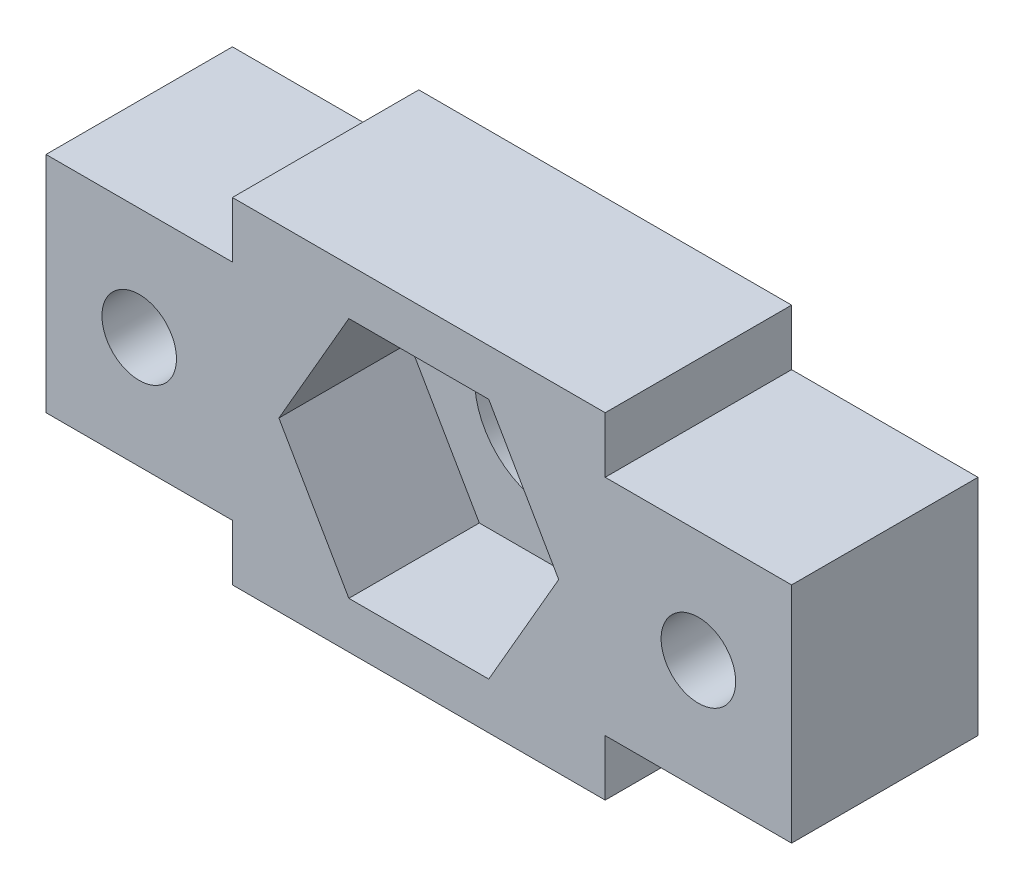
ISO-10303-21;
HEADER;
FILE_DESCRIPTION(('STEP AP214'),'2;1');
FILE_NAME('part.step','',(''),(''),'','','');
FILE_SCHEMA(('AUTOMOTIVE_DESIGN { 1 0 10303 214 1 1 1 1 }'));
ENDSEC;
DATA;
#1=APPLICATION_CONTEXT('core data for automotive mechanical design processes');
#2=APPLICATION_PROTOCOL_DEFINITION('international standard','automotive_design',2000,#1);
#3=PRODUCT_CONTEXT('',#1,'mechanical');
#4=PRODUCT('Part','Part','',(#3));
#5=PRODUCT_RELATED_PRODUCT_CATEGORY('part','',(#4));
#6=PRODUCT_DEFINITION_FORMATION('','',#4);
#7=PRODUCT_DEFINITION_CONTEXT('part definition',#1,'design');
#8=PRODUCT_DEFINITION('design','',#6,#7);
#9=PRODUCT_DEFINITION_SHAPE('','',#8);
#10=(LENGTH_UNIT() NAMED_UNIT(*) SI_UNIT(.MILLI.,.METRE.));
#11=(NAMED_UNIT(*) PLANE_ANGLE_UNIT() SI_UNIT($,.RADIAN.));
#12=(NAMED_UNIT(*) SI_UNIT($,.STERADIAN.) SOLID_ANGLE_UNIT());
#13=UNCERTAINTY_MEASURE_WITH_UNIT(LENGTH_MEASURE(1.E-05),#10,'distance_accuracy_value','');
#14=(GEOMETRIC_REPRESENTATION_CONTEXT(3) GLOBAL_UNCERTAINTY_ASSIGNED_CONTEXT((#13)) GLOBAL_UNIT_ASSIGNED_CONTEXT((#10,
#11,#12)) REPRESENTATION_CONTEXT('',''));
#15=CARTESIAN_POINT('',(0.,0.,0.));
#16=DIRECTION('',(0.,0.,1.));
#17=DIRECTION('',(1.,0.,0.));
#18=AXIS2_PLACEMENT_3D('',#15,#16,#17);
#19=CARTESIAN_POINT('',(-69.9999999999998,-15.9999999999999,10.));
#20=DIRECTION('',(1.,0.,0.));
#21=DIRECTION('',(0.,0.,-1.));
#22=AXIS2_PLACEMENT_3D('',#19,#20,#21);
#23=PLANE('',#22);
#24=DIRECTION('',(0.,-1.,0.));
#25=VECTOR('',#24,1.);
#26=CARTESIAN_POINT('',(-69.9999999999998,-15.9999999999999,10.));
#27=LINE('',#26,#25);
#28=CARTESIAN_POINT('',(-69.9999999999998,-30.9999999999999,10.));
#29=VERTEX_POINT('',#28);
#30=CARTESIAN_POINT('',(-69.9999999999998,-33.9999999999999,10.));
#31=VERTEX_POINT('',#30);
#32=EDGE_CURVE('E383',#29,#31,#27,.T.);
#33=ORIENTED_EDGE('',*,*,#32,.F.);
#34=DIRECTION('',(0.,0.,1.));
#35=VECTOR('',#34,1.);
#36=CARTESIAN_POINT('',(-69.9999999999998,-30.9999999999999,3.));
#37=LINE('',#36,#35);
#38=CARTESIAN_POINT('',(-69.9999999999998,-30.9999999999999,0.));
#39=VERTEX_POINT('',#38);
#40=EDGE_CURVE('E345',#39,#29,#37,.T.);
#41=ORIENTED_EDGE('',*,*,#40,.F.);
#42=DIRECTION('',(0.,1.,0.));
#43=VECTOR('',#42,1.);
#44=CARTESIAN_POINT('',(-69.9999999999998,-15.9999999999999,0.));
#45=LINE('',#44,#43);
#46=CARTESIAN_POINT('',(-69.9999999999998,-33.9999999999999,0.));
#47=VERTEX_POINT('',#46);
#48=EDGE_CURVE('E332',#47,#39,#45,.T.);
#49=ORIENTED_EDGE('',*,*,#48,.F.);
#50=DIRECTION('',(0.,0.,-1.));
#51=VECTOR('',#50,1.);
#52=CARTESIAN_POINT('',(-69.9999999999998,-33.9999999999999,10.));
#53=LINE('',#52,#51);
#54=EDGE_CURVE('E396',#31,#47,#53,.T.);
#55=ORIENTED_EDGE('',*,*,#54,.F.);
#56=EDGE_LOOP('',(#33,#41,#49,#55));
#57=FACE_BOUND('',#56,.T.);
#58=ADVANCED_FACE('F169',(#57),#23,.F.);
#59=DIRECTION('',(0.,0.,-1.));
#60=VECTOR('',#59,1.);
#61=CARTESIAN_POINT('',(-69.9999999999998,-18.9999999999999,3.));
#62=LINE('',#61,#60);
#63=CARTESIAN_POINT('',(-69.9999999999998,-18.9999999999999,10.));
#64=VERTEX_POINT('',#63);
#65=CARTESIAN_POINT('',(-69.9999999999998,-18.9999999999999,0.));
#66=VERTEX_POINT('',#65);
#67=EDGE_CURVE('E347',#64,#66,#62,.T.);
#68=ORIENTED_EDGE('',*,*,#67,.F.);
#69=CARTESIAN_POINT('',(-69.9999999999998,-15.9999999999999,10.));
#70=VERTEX_POINT('',#69);
#71=EDGE_CURVE('E384',#70,#64,#27,.T.);
#72=ORIENTED_EDGE('',*,*,#71,.F.);
#73=DIRECTION('',(0.,0.,-1.));
#74=VECTOR('',#73,1.);
#75=CARTESIAN_POINT('',(-69.9999999999998,-15.9999999999999,10.));
#76=LINE('',#75,#74);
#77=CARTESIAN_POINT('',(-69.9999999999998,-15.9999999999999,0.));
#78=VERTEX_POINT('',#77);
#79=EDGE_CURVE('E398',#70,#78,#76,.T.);
#80=ORIENTED_EDGE('',*,*,#79,.T.);
#81=EDGE_CURVE('E335',#66,#78,#45,.T.);
#82=ORIENTED_EDGE('',*,*,#81,.F.);
#83=EDGE_LOOP('',(#68,#72,#80,#82));
#84=FACE_BOUND('',#83,.T.);
#85=ADVANCED_FACE('F500',(#84),#23,.F.);
#86=CARTESIAN_POINT('',(-49.9999999999998,-15.9999999999999,10.));
#87=DIRECTION('',(-1.,0.,0.));
#88=DIRECTION('',(0.,0.,1.));
#89=AXIS2_PLACEMENT_3D('',#86,#87,#88);
#90=PLANE('',#89);
#91=DIRECTION('',(0.,0.,-1.));
#92=VECTOR('',#91,1.);
#93=CARTESIAN_POINT('',(-49.9999999999998,-30.9999999999999,3.));
#94=LINE('',#93,#92);
#95=CARTESIAN_POINT('',(-49.9999999999998,-30.9999999999999,10.));
#96=VERTEX_POINT('',#95);
#97=CARTESIAN_POINT('',(-49.9999999999998,-30.9999999999999,0.));
#98=VERTEX_POINT('',#97);
#99=EDGE_CURVE('E334',#96,#98,#94,.T.);
#100=ORIENTED_EDGE('',*,*,#99,.F.);
#101=DIRECTION('',(0.,1.,0.));
#102=VECTOR('',#101,1.);
#103=CARTESIAN_POINT('',(-49.9999999999998,-15.9999999999999,10.));
#104=LINE('',#103,#102);
#105=CARTESIAN_POINT('',(-49.9999999999998,-33.9999999999999,10.));
#106=VERTEX_POINT('',#105);
#107=EDGE_CURVE('E390',#106,#96,#104,.T.);
#108=ORIENTED_EDGE('',*,*,#107,.F.);
#109=DIRECTION('',(0.,0.,-1.));
#110=VECTOR('',#109,1.);
#111=CARTESIAN_POINT('',(-49.9999999999998,-33.9999999999999,10.));
#112=LINE('',#111,#110);
#113=CARTESIAN_POINT('',(-49.9999999999998,-33.9999999999999,0.));
#114=VERTEX_POINT('',#113);
#115=EDGE_CURVE('E394',#106,#114,#112,.T.);
#116=ORIENTED_EDGE('',*,*,#115,.T.);
#117=DIRECTION('',(0.,-1.,0.));
#118=VECTOR('',#117,1.);
#119=CARTESIAN_POINT('',(-49.9999999999998,-15.9999999999999,0.));
#120=LINE('',#119,#118);
#121=EDGE_CURVE('E325',#98,#114,#120,.T.);
#122=ORIENTED_EDGE('',*,*,#121,.F.);
#123=EDGE_LOOP('',(#100,#108,#116,#122));
#124=FACE_BOUND('',#123,.T.);
#125=ADVANCED_FACE('F505',(#124),#90,.F.);
#126=CARTESIAN_POINT('',(-39.9999999999998,-18.9999999999999,3.));
#127=DIRECTION('',(0.,-1.,0.));
#128=DIRECTION('',(1.,0.,0.));
#129=AXIS2_PLACEMENT_3D('',#126,#127,#128);
#130=PLANE('',#129);
#131=DIRECTION('',(0.,0.,-1.));
#132=VECTOR('',#131,1.);
#133=CARTESIAN_POINT('',(-79.9999999999998,-18.9999999999999,3.));
#134=LINE('',#133,#132);
#135=CARTESIAN_POINT('',(-79.9999999999998,-18.9999999999999,10.));
#136=VERTEX_POINT('',#135);
#137=CARTESIAN_POINT('',(-79.9999999999998,-18.9999999999999,0.));
#138=VERTEX_POINT('',#137);
#139=EDGE_CURVE('E304',#136,#138,#134,.T.);
#140=ORIENTED_EDGE('',*,*,#139,.F.);
#141=DIRECTION('',(-1.,0.,0.));
#142=VECTOR('',#141,1.);
#143=CARTESIAN_POINT('',(1.05731395860786E-13,-18.9999999999998,10.));
#144=LINE('',#143,#142);
#145=EDGE_CURVE('E322',#64,#136,#144,.T.);
#146=ORIENTED_EDGE('',*,*,#145,.F.);
#147=ORIENTED_EDGE('',*,*,#67,.T.);
#148=DIRECTION('',(-1.,0.,0.));
#149=VECTOR('',#148,1.);
#150=CARTESIAN_POINT('',(-39.9999999999998,-18.9999999999999,0.));
#151=LINE('',#150,#149);
#152=EDGE_CURVE('E413',#66,#138,#151,.T.);
#153=ORIENTED_EDGE('',*,*,#152,.T.);
#154=EDGE_LOOP('',(#140,#146,#147,#153));
#155=FACE_BOUND('',#154,.T.);
#156=ADVANCED_FACE('F538',(#155),#130,.F.);
#157=CARTESIAN_POINT('',(-39.9999999999998,-30.9999999999999,3.));
#158=DIRECTION('',(0.,1.,0.));
#159=DIRECTION('',(-1.,0.,0.));
#160=AXIS2_PLACEMENT_3D('',#157,#158,#159);
#161=PLANE('',#160);
#162=DIRECTION('',(1.,0.,0.));
#163=VECTOR('',#162,1.);
#164=CARTESIAN_POINT('',(-39.9999999999998,-30.9999999999999,0.));
#165=LINE('',#164,#163);
#166=CARTESIAN_POINT('',(-79.9999999999998,-30.9999999999999,0.));
#167=VERTEX_POINT('',#166);
#168=EDGE_CURVE('E419',#167,#39,#165,.T.);
#169=ORIENTED_EDGE('',*,*,#168,.T.);
#170=ORIENTED_EDGE('',*,*,#40,.T.);
#171=DIRECTION('',(1.,0.,0.));
#172=VECTOR('',#171,1.);
#173=CARTESIAN_POINT('',(1.06772229946372E-13,-30.9999999999999,10.));
#174=LINE('',#173,#172);
#175=CARTESIAN_POINT('',(-79.9999999999998,-30.9999999999999,10.));
#176=VERTEX_POINT('',#175);
#177=EDGE_CURVE('E451',#176,#29,#174,.T.);
#178=ORIENTED_EDGE('',*,*,#177,.F.);
#179=DIRECTION('',(0.,0.,-1.));
#180=VECTOR('',#179,1.);
#181=CARTESIAN_POINT('',(-79.9999999999998,-30.9999999999999,3.));
#182=LINE('',#181,#180);
#183=EDGE_CURVE('E423',#176,#167,#182,.T.);
#184=ORIENTED_EDGE('',*,*,#183,.T.);
#185=EDGE_LOOP('',(#169,#170,#178,#184));
#186=FACE_BOUND('',#185,.T.);
#187=ADVANCED_FACE('F443',(#186),#161,.F.);
#188=CARTESIAN_POINT('',(0.,0.,3.));
#189=DIRECTION('',(0.,0.,-1.));
#190=DIRECTION('',(-1.,0.,0.));
#191=AXIS2_PLACEMENT_3D('',#188,#189,#190);
#192=PLANE('',#191);
#193=DIRECTION('',(-0.5,0.866025403784439,0.));
#194=VECTOR('',#193,1.);
#195=CARTESIAN_POINT('',(-52.4944465005347,-24.9999999999999,3.));
#196=LINE('',#195,#194);
#197=CARTESIAN_POINT('',(-52.4944465005347,-24.9999999999999,3.));
#198=VERTEX_POINT('',#197);
#199=CARTESIAN_POINT('',(-56.2472232502672,-18.4999999999999,3.));
#200=VERTEX_POINT('',#199);
#201=EDGE_CURVE('E349',#198,#200,#196,.T.);
#202=ORIENTED_EDGE('',*,*,#201,.T.);
#203=DIRECTION('',(-1.,0.,0.));
#204=VECTOR('',#203,1.);
#205=CARTESIAN_POINT('',(0.,-18.4999999999999,3.));
#206=LINE('',#205,#204);
#207=CARTESIAN_POINT('',(-63.7527767497324,-18.4999999999998,3.));
#208=VERTEX_POINT('',#207);
#209=EDGE_CURVE('E460',#200,#208,#206,.T.);
#210=ORIENTED_EDGE('',*,*,#209,.T.);
#211=DIRECTION('',(-0.499999999999999,-0.866025403784439,0.));
#212=VECTOR('',#211,1.);
#213=CARTESIAN_POINT('',(-63.7527767497324,-18.4999999999998,3.));
#214=LINE('',#213,#212);
#215=CARTESIAN_POINT('',(-67.5055534994649,-24.9999999999999,3.));
#216=VERTEX_POINT('',#215);
#217=EDGE_CURVE('E12',#208,#216,#214,.T.);
#218=ORIENTED_EDGE('',*,*,#217,.T.);
#219=DIRECTION('',(0.5,-0.866025403784439,0.));
#220=VECTOR('',#219,1.);
#221=CARTESIAN_POINT('',(-67.5055534994649,-24.9999999999999,3.));
#222=LINE('',#221,#220);
#223=CARTESIAN_POINT('',(-63.7527767497323,-31.4999999999999,3.));
#224=VERTEX_POINT('',#223);
#225=EDGE_CURVE('E185',#216,#224,#222,.T.);
#226=ORIENTED_EDGE('',*,*,#225,.T.);
#227=DIRECTION('',(1.,0.,0.));
#228=VECTOR('',#227,1.);
#229=CARTESIAN_POINT('',(0.,-31.4999999999998,3.));
#230=LINE('',#229,#228);
#231=CARTESIAN_POINT('',(-56.2472232502672,-31.4999999999999,3.));
#232=VERTEX_POINT('',#231);
#233=EDGE_CURVE('E463',#224,#232,#230,.T.);
#234=ORIENTED_EDGE('',*,*,#233,.T.);
#235=DIRECTION('',(0.5,0.866025403784439,0.));
#236=VECTOR('',#235,1.);
#237=CARTESIAN_POINT('',(-56.2472232502672,-31.4999999999999,3.));
#238=LINE('',#237,#236);
#239=EDGE_CURVE('E178',#232,#198,#238,.T.);
#240=ORIENTED_EDGE('',*,*,#239,.T.);
#241=EDGE_LOOP('',(#202,#210,#218,#226,#234,#240));
#242=FACE_BOUND('',#241,.T.);
#243=CARTESIAN_POINT('',(-59.9999999999998,-24.9999999999999,3.));
#244=DIRECTION('',(0.,0.,1.));
#245=DIRECTION('',(1.,0.,0.));
#246=AXIS2_PLACEMENT_3D('',#243,#244,#245);
#247=CIRCLE('',#246,4.00000000000001);
#248=CARTESIAN_POINT('',(-55.9999999999998,-24.9999999999999,3.));
#249=VERTEX_POINT('',#248);
#250=EDGE_CURVE('E401',#249,#249,#247,.T.);
#251=ORIENTED_EDGE('',*,*,#250,.F.);
#252=EDGE_LOOP('',(#251));
#253=FACE_BOUND('',#252,.T.);
#254=ADVANCED_FACE('F464',(#242,#253),#192,.F.);
#255=CARTESIAN_POINT('',(0.,0.,0.));
#256=DIRECTION('',(0.,0.,-1.));
#257=DIRECTION('',(-1.,0.,0.));
#258=AXIS2_PLACEMENT_3D('',#255,#256,#257);
#259=PLANE('',#258);
#260=CARTESIAN_POINT('',(-59.9999999999998,-24.9999999999999,0.));
#261=DIRECTION('',(0.,0.,1.));
#262=DIRECTION('',(1.,0.,0.));
#263=AXIS2_PLACEMENT_3D('',#260,#261,#262);
#264=CIRCLE('',#263,4.00000000000001);
#265=CARTESIAN_POINT('',(-55.9999999999998,-24.9999999999999,0.));
#266=VERTEX_POINT('',#265);
#267=EDGE_CURVE('E400',#266,#266,#264,.T.);
#268=ORIENTED_EDGE('',*,*,#267,.T.);
#269=EDGE_LOOP('',(#268));
#270=FACE_BOUND('',#269,.T.);
#271=CARTESIAN_POINT('',(-74.9999999999998,-24.9999999999999,0.));
#272=DIRECTION('',(0.,0.,1.));
#273=DIRECTION('',(1.,0.,0.));
#274=AXIS2_PLACEMENT_3D('',#271,#272,#273);
#275=CIRCLE('',#274,2.);
#276=CARTESIAN_POINT('',(-72.9999999999998,-24.9999999999999,0.));
#277=VERTEX_POINT('',#276);
#278=EDGE_CURVE('E404',#277,#277,#275,.T.);
#279=ORIENTED_EDGE('',*,*,#278,.T.);
#280=EDGE_LOOP('',(#279));
#281=FACE_BOUND('',#280,.T.);
#282=CARTESIAN_POINT('',(-44.9999999999998,-24.9999999999999,0.));
#283=DIRECTION('',(0.,0.,1.));
#284=DIRECTION('',(1.,0.,0.));
#285=AXIS2_PLACEMENT_3D('',#282,#283,#284);
#286=CIRCLE('',#285,2.);
#287=CARTESIAN_POINT('',(-42.9999999999998,-24.9999999999999,0.));
#288=VERTEX_POINT('',#287);
#289=EDGE_CURVE('E409',#288,#288,#286,.T.);
#290=ORIENTED_EDGE('',*,*,#289,.T.);
#291=EDGE_LOOP('',(#290));
#292=FACE_BOUND('',#291,.T.);
#293=CARTESIAN_POINT('',(-39.9999999999998,-30.9999999999999,0.));
#294=VERTEX_POINT('',#293);
#295=EDGE_CURVE('E418',#98,#294,#165,.T.);
#296=ORIENTED_EDGE('',*,*,#295,.F.);
#297=ORIENTED_EDGE('',*,*,#121,.T.);
#298=DIRECTION('',(-1.,0.,0.));
#299=VECTOR('',#298,1.);
#300=CARTESIAN_POINT('',(-49.9999999999998,-33.9999999999999,0.));
#301=LINE('',#300,#299);
#302=EDGE_CURVE('E321',#114,#47,#301,.T.);
#303=ORIENTED_EDGE('',*,*,#302,.T.);
#304=ORIENTED_EDGE('',*,*,#48,.T.);
#305=ORIENTED_EDGE('',*,*,#168,.F.);
#306=DIRECTION('',(0.,-1.,0.));
#307=VECTOR('',#306,1.);
#308=CARTESIAN_POINT('',(-79.9999999999998,-18.9999999999999,0.));
#309=LINE('',#308,#307);
#310=EDGE_CURVE('E416',#138,#167,#309,.T.);
#311=ORIENTED_EDGE('',*,*,#310,.F.);
#312=ORIENTED_EDGE('',*,*,#152,.F.);
#313=ORIENTED_EDGE('',*,*,#81,.T.);
#314=DIRECTION('',(1.,0.,0.));
#315=VECTOR('',#314,1.);
#316=CARTESIAN_POINT('',(-49.9999999999998,-15.9999999999999,0.));
#317=LINE('',#316,#315);
#318=CARTESIAN_POINT('',(-49.9999999999998,-15.9999999999999,0.));
#319=VERTEX_POINT('',#318);
#320=EDGE_CURVE('E340',#78,#319,#317,.T.);
#321=ORIENTED_EDGE('',*,*,#320,.T.);
#322=CARTESIAN_POINT('',(-49.9999999999998,-18.9999999999999,0.));
#323=VERTEX_POINT('',#322);
#324=EDGE_CURVE('E337',#319,#323,#120,.T.);
#325=ORIENTED_EDGE('',*,*,#324,.T.);
#326=CARTESIAN_POINT('',(-39.9999999999998,-18.9999999999999,0.));
#327=VERTEX_POINT('',#326);
#328=EDGE_CURVE('E414',#327,#323,#151,.T.);
#329=ORIENTED_EDGE('',*,*,#328,.F.);
#330=DIRECTION('',(0.,1.,0.));
#331=VECTOR('',#330,1.);
#332=CARTESIAN_POINT('',(-39.9999999999998,-18.9999999999999,0.));
#333=LINE('',#332,#331);
#334=EDGE_CURVE('E301',#294,#327,#333,.T.);
#335=ORIENTED_EDGE('',*,*,#334,.F.);
#336=EDGE_LOOP('',(#296,#297,#303,#304,#305,#311,#312,#313,#321,#325,#329,#335));
#337=FACE_BOUND('',#336,.T.);
#338=ADVANCED_FACE('F437',(#270,#281,#292,#337),#259,.T.);
#339=CARTESIAN_POINT('',(-39.9999999999998,-18.9999999999999,3.));
#340=DIRECTION('',(-1.,0.,0.));
#341=DIRECTION('',(0.,0.,1.));
#342=AXIS2_PLACEMENT_3D('',#339,#340,#341);
#343=PLANE('',#342);
#344=ORIENTED_EDGE('',*,*,#334,.T.);
#345=DIRECTION('',(0.,0.,-1.));
#346=VECTOR('',#345,1.);
#347=CARTESIAN_POINT('',(-39.9999999999998,-18.9999999999999,3.));
#348=LINE('',#347,#346);
#349=CARTESIAN_POINT('',(-39.9999999999998,-18.9999999999999,10.));
#350=VERTEX_POINT('',#349);
#351=EDGE_CURVE('E173',#350,#327,#348,.T.);
#352=ORIENTED_EDGE('',*,*,#351,.F.);
#353=DIRECTION('',(0.,-1.,0.));
#354=VECTOR('',#353,1.);
#355=CARTESIAN_POINT('',(-39.9999999999998,0.,10.));
#356=LINE('',#355,#354);
#357=CARTESIAN_POINT('',(-39.9999999999998,-30.9999999999999,10.));
#358=VERTEX_POINT('',#357);
#359=EDGE_CURVE('E299',#350,#358,#356,.T.);
#360=ORIENTED_EDGE('',*,*,#359,.T.);
#361=DIRECTION('',(0.,0.,-1.));
#362=VECTOR('',#361,1.);
#363=CARTESIAN_POINT('',(-39.9999999999998,-30.9999999999999,3.));
#364=LINE('',#363,#362);
#365=EDGE_CURVE('E421',#358,#294,#364,.T.);
#366=ORIENTED_EDGE('',*,*,#365,.T.);
#367=EDGE_LOOP('',(#344,#352,#360,#366));
#368=FACE_BOUND('',#367,.T.);
#369=ADVANCED_FACE('F171',(#368),#343,.F.);
#370=ORIENTED_EDGE('',*,*,#328,.T.);
#371=DIRECTION('',(0.,0.,1.));
#372=VECTOR('',#371,1.);
#373=CARTESIAN_POINT('',(-49.9999999999998,-18.9999999999999,3.));
#374=LINE('',#373,#372);
#375=CARTESIAN_POINT('',(-49.9999999999998,-18.9999999999999,10.));
#376=VERTEX_POINT('',#375);
#377=EDGE_CURVE('E320',#323,#376,#374,.T.);
#378=ORIENTED_EDGE('',*,*,#377,.T.);
#379=DIRECTION('',(1.,0.,0.));
#380=VECTOR('',#379,1.);
#381=CARTESIAN_POINT('',(1.05731395860786E-13,-18.9999999999998,10.));
#382=LINE('',#381,#380);
#383=EDGE_CURVE('E311',#376,#350,#382,.T.);
#384=ORIENTED_EDGE('',*,*,#383,.T.);
#385=ORIENTED_EDGE('',*,*,#351,.T.);
#386=EDGE_LOOP('',(#370,#378,#384,#385));
#387=FACE_BOUND('',#386,.T.);
#388=ADVANCED_FACE('F318',(#387),#130,.F.);
#389=CARTESIAN_POINT('',(-79.9999999999998,-18.9999999999999,3.));
#390=DIRECTION('',(1.,0.,0.));
#391=DIRECTION('',(0.,0.,-1.));
#392=AXIS2_PLACEMENT_3D('',#389,#390,#391);
#393=PLANE('',#392);
#394=ORIENTED_EDGE('',*,*,#310,.T.);
#395=ORIENTED_EDGE('',*,*,#183,.F.);
#396=DIRECTION('',(0.,-1.,0.));
#397=VECTOR('',#396,1.);
#398=CARTESIAN_POINT('',(-79.9999999999998,0.,10.));
#399=LINE('',#398,#397);
#400=EDGE_CURVE('E328',#136,#176,#399,.T.);
#401=ORIENTED_EDGE('',*,*,#400,.F.);
#402=ORIENTED_EDGE('',*,*,#139,.T.);
#403=EDGE_LOOP('',(#394,#395,#401,#402));
#404=FACE_BOUND('',#403,.T.);
#405=ADVANCED_FACE('F429',(#404),#393,.F.);
#406=ORIENTED_EDGE('',*,*,#365,.F.);
#407=DIRECTION('',(1.,0.,0.));
#408=VECTOR('',#407,1.);
#409=CARTESIAN_POINT('',(1.04083408558608E-13,-30.9999999999999,10.));
#410=LINE('',#409,#408);
#411=EDGE_CURVE('E315',#96,#358,#410,.T.);
#412=ORIENTED_EDGE('',*,*,#411,.F.);
#413=ORIENTED_EDGE('',*,*,#99,.T.);
#414=ORIENTED_EDGE('',*,*,#295,.T.);
#415=EDGE_LOOP('',(#406,#412,#413,#414));
#416=FACE_BOUND('',#415,.T.);
#417=ADVANCED_FACE('F526',(#416),#161,.F.);
#418=CARTESIAN_POINT('',(-44.9999999999998,-24.9999999999999,3.));
#419=DIRECTION('',(0.,0.,-1.));
#420=DIRECTION('',(-1.,0.,0.));
#421=AXIS2_PLACEMENT_3D('',#418,#419,#420);
#422=CYLINDRICAL_SURFACE('',#421,2.);
#423=ORIENTED_EDGE('',*,*,#289,.F.);
#424=EDGE_LOOP('',(#423));
#425=FACE_BOUND('',#424,.T.);
#426=CARTESIAN_POINT('',(-44.9999999999998,-24.9999999999999,10.));
#427=DIRECTION('',(0.,0.,1.));
#428=DIRECTION('',(1.,0.,0.));
#429=AXIS2_PLACEMENT_3D('',#426,#427,#428);
#430=CIRCLE('',#429,2.);
#431=CARTESIAN_POINT('',(-42.9999999999998,-24.9999999999999,10.));
#432=VERTEX_POINT('',#431);
#433=EDGE_CURVE('E316',#432,#432,#430,.T.);
#434=ORIENTED_EDGE('',*,*,#433,.T.);
#435=EDGE_LOOP('',(#434));
#436=FACE_BOUND('',#435,.T.);
#437=ADVANCED_FACE('F522',(#425,#436),#422,.F.);
#438=CARTESIAN_POINT('',(-74.9999999999998,-24.9999999999999,3.));
#439=DIRECTION('',(0.,0.,-1.));
#440=DIRECTION('',(-1.,0.,0.));
#441=AXIS2_PLACEMENT_3D('',#438,#439,#440);
#442=CYLINDRICAL_SURFACE('',#441,2.);
#443=ORIENTED_EDGE('',*,*,#278,.F.);
#444=EDGE_LOOP('',(#443));
#445=FACE_BOUND('',#444,.T.);
#446=CARTESIAN_POINT('',(-74.9999999999998,-24.9999999999999,10.));
#447=DIRECTION('',(0.,0.,1.));
#448=DIRECTION('',(1.,0.,0.));
#449=AXIS2_PLACEMENT_3D('',#446,#447,#448);
#450=CIRCLE('',#449,2.);
#451=CARTESIAN_POINT('',(-72.9999999999998,-24.9999999999999,10.));
#452=VERTEX_POINT('',#451);
#453=EDGE_CURVE('E457',#452,#452,#450,.T.);
#454=ORIENTED_EDGE('',*,*,#453,.T.);
#455=EDGE_LOOP('',(#454));
#456=FACE_BOUND('',#455,.T.);
#457=ADVANCED_FACE('F518',(#445,#456),#442,.F.);
#458=CARTESIAN_POINT('',(-59.9999999999998,-24.9999999999999,3.));
#459=DIRECTION('',(0.,0.,-1.));
#460=DIRECTION('',(-1.,0.,0.));
#461=AXIS2_PLACEMENT_3D('',#458,#459,#460);
#462=CYLINDRICAL_SURFACE('',#461,4.00000000000001);
#463=ORIENTED_EDGE('',*,*,#250,.T.);
#464=EDGE_LOOP('',(#463));
#465=FACE_BOUND('',#464,.T.);
#466=ORIENTED_EDGE('',*,*,#267,.F.);
#467=EDGE_LOOP('',(#466));
#468=FACE_BOUND('',#467,.T.);
#469=ADVANCED_FACE('F515',(#465,#468),#462,.F.);
#470=CARTESIAN_POINT('',(0.,0.,10.));
#471=DIRECTION('',(0.,0.,1.));
#472=DIRECTION('',(1.,0.,0.));
#473=AXIS2_PLACEMENT_3D('',#470,#471,#472);
#474=PLANE('',#473);
#475=DIRECTION('',(-1.,0.,0.));
#476=VECTOR('',#475,1.);
#477=CARTESIAN_POINT('',(-49.9999999999998,-15.9999999999999,10.));
#478=LINE('',#477,#476);
#479=CARTESIAN_POINT('',(-49.9999999999998,-15.9999999999999,10.));
#480=VERTEX_POINT('',#479);
#481=EDGE_CURVE('E381',#480,#70,#478,.T.);
#482=ORIENTED_EDGE('',*,*,#481,.T.);
#483=ORIENTED_EDGE('',*,*,#71,.T.);
#484=ORIENTED_EDGE('',*,*,#145,.T.);
#485=ORIENTED_EDGE('',*,*,#400,.T.);
#486=ORIENTED_EDGE('',*,*,#177,.T.);
#487=ORIENTED_EDGE('',*,*,#32,.T.);
#488=DIRECTION('',(1.,0.,0.));
#489=VECTOR('',#488,1.);
#490=CARTESIAN_POINT('',(-49.9999999999998,-33.9999999999999,10.));
#491=LINE('',#490,#489);
#492=EDGE_CURVE('E387',#31,#106,#491,.T.);
#493=ORIENTED_EDGE('',*,*,#492,.T.);
#494=ORIENTED_EDGE('',*,*,#107,.T.);
#495=ORIENTED_EDGE('',*,*,#411,.T.);
#496=ORIENTED_EDGE('',*,*,#359,.F.);
#497=ORIENTED_EDGE('',*,*,#383,.F.);
#498=EDGE_CURVE('E389',#376,#480,#104,.T.);
#499=ORIENTED_EDGE('',*,*,#498,.T.);
#500=EDGE_LOOP('',(#482,#483,#484,#485,#486,#487,#493,#494,#495,#496,#497,#499));
#501=FACE_BOUND('',#500,.T.);
#502=DIRECTION('',(-1.,0.,0.));
#503=VECTOR('',#502,1.);
#504=CARTESIAN_POINT('',(-56.2472232502672,-18.4999999999999,10.));
#505=LINE('',#504,#503);
#506=CARTESIAN_POINT('',(-56.2472232502672,-18.4999999999999,10.));
#507=VERTEX_POINT('',#506);
#508=CARTESIAN_POINT('',(-63.7527767497324,-18.4999999999998,10.));
#509=VERTEX_POINT('',#508);
#510=EDGE_CURVE('E352',#507,#509,#505,.T.);
#511=ORIENTED_EDGE('',*,*,#510,.F.);
#512=DIRECTION('',(-0.5,0.866025403784439,0.));
#513=VECTOR('',#512,1.);
#514=CARTESIAN_POINT('',(-52.4944465005347,-24.9999999999999,10.));
#515=LINE('',#514,#513);
#516=CARTESIAN_POINT('',(-52.4944465005347,-24.9999999999999,10.));
#517=VERTEX_POINT('',#516);
#518=EDGE_CURVE('E350',#517,#507,#515,.T.);
#519=ORIENTED_EDGE('',*,*,#518,.F.);
#520=DIRECTION('',(0.5,0.866025403784439,0.));
#521=VECTOR('',#520,1.);
#522=CARTESIAN_POINT('',(-56.2472232502672,-31.4999999999999,10.));
#523=LINE('',#522,#521);
#524=CARTESIAN_POINT('',(-56.2472232502672,-31.4999999999999,10.));
#525=VERTEX_POINT('',#524);
#526=EDGE_CURVE('E361',#525,#517,#523,.T.);
#527=ORIENTED_EDGE('',*,*,#526,.F.);
#528=DIRECTION('',(1.,0.,0.));
#529=VECTOR('',#528,1.);
#530=CARTESIAN_POINT('',(-63.7527767497323,-31.4999999999999,10.));
#531=LINE('',#530,#529);
#532=CARTESIAN_POINT('',(-63.7527767497323,-31.4999999999999,10.));
#533=VERTEX_POINT('',#532);
#534=EDGE_CURVE('E358',#533,#525,#531,.T.);
#535=ORIENTED_EDGE('',*,*,#534,.F.);
#536=DIRECTION('',(0.5,-0.866025403784439,0.));
#537=VECTOR('',#536,1.);
#538=CARTESIAN_POINT('',(-67.5055534994649,-24.9999999999999,10.));
#539=LINE('',#538,#537);
#540=CARTESIAN_POINT('',(-67.5055534994649,-24.9999999999999,10.));
#541=VERTEX_POINT('',#540);
#542=EDGE_CURVE('E356',#541,#533,#539,.T.);
#543=ORIENTED_EDGE('',*,*,#542,.F.);
#544=DIRECTION('',(-0.499999999999999,-0.866025403784439,0.));
#545=VECTOR('',#544,1.);
#546=CARTESIAN_POINT('',(-63.7527767497324,-18.4999999999998,10.));
#547=LINE('',#546,#545);
#548=EDGE_CURVE('E354',#509,#541,#547,.T.);
#549=ORIENTED_EDGE('',*,*,#548,.F.);
#550=EDGE_LOOP('',(#511,#519,#527,#535,#543,#549));
#551=FACE_BOUND('',#550,.T.);
#552=ORIENTED_EDGE('',*,*,#433,.F.);
#553=EDGE_LOOP('',(#552));
#554=FACE_BOUND('',#553,.T.);
#555=ORIENTED_EDGE('',*,*,#453,.F.);
#556=EDGE_LOOP('',(#555));
#557=FACE_BOUND('',#556,.T.);
#558=ADVANCED_FACE('F309',(#501,#551,#554,#557),#474,.T.);
#559=CARTESIAN_POINT('',(-49.9999999999998,-15.9999999999999,10.));
#560=DIRECTION('',(0.,-1.,0.));
#561=DIRECTION('',(1.,0.,0.));
#562=AXIS2_PLACEMENT_3D('',#559,#560,#561);
#563=PLANE('',#562);
#564=DIRECTION('',(0.,0.,-1.));
#565=VECTOR('',#564,1.);
#566=CARTESIAN_POINT('',(-49.9999999999998,-15.9999999999999,10.));
#567=LINE('',#566,#565);
#568=EDGE_CURVE('E392',#480,#319,#567,.T.);
#569=ORIENTED_EDGE('',*,*,#568,.T.);
#570=ORIENTED_EDGE('',*,*,#320,.F.);
#571=ORIENTED_EDGE('',*,*,#79,.F.);
#572=ORIENTED_EDGE('',*,*,#481,.F.);
#573=EDGE_LOOP('',(#569,#570,#571,#572));
#574=FACE_BOUND('',#573,.T.);
#575=ADVANCED_FACE('F511',(#574),#563,.F.);
#576=CARTESIAN_POINT('',(-49.9999999999998,-33.9999999999999,10.));
#577=DIRECTION('',(0.,1.,0.));
#578=DIRECTION('',(-1.,0.,0.));
#579=AXIS2_PLACEMENT_3D('',#576,#577,#578);
#580=PLANE('',#579);
#581=ORIENTED_EDGE('',*,*,#54,.T.);
#582=ORIENTED_EDGE('',*,*,#302,.F.);
#583=ORIENTED_EDGE('',*,*,#115,.F.);
#584=ORIENTED_EDGE('',*,*,#492,.F.);
#585=EDGE_LOOP('',(#581,#582,#583,#584));
#586=FACE_BOUND('',#585,.T.);
#587=ADVANCED_FACE('F509',(#586),#580,.F.);
#588=ORIENTED_EDGE('',*,*,#498,.F.);
#589=ORIENTED_EDGE('',*,*,#377,.F.);
#590=ORIENTED_EDGE('',*,*,#324,.F.);
#591=ORIENTED_EDGE('',*,*,#568,.F.);
#592=EDGE_LOOP('',(#588,#589,#590,#591));
#593=FACE_BOUND('',#592,.T.);
#594=ADVANCED_FACE('F548',(#593),#90,.F.);
#595=CARTESIAN_POINT('',(-52.4944465005347,-24.9999999999999,10.));
#596=DIRECTION('',(-0.866025403784439,-0.5,0.));
#597=DIRECTION('',(0.5,-0.866025403784439,0.));
#598=AXIS2_PLACEMENT_3D('',#595,#596,#597);
#599=PLANE('',#598);
#600=DIRECTION('',(0.,0.,-1.));
#601=VECTOR('',#600,1.);
#602=CARTESIAN_POINT('',(-56.2472232502672,-18.4999999999999,10.));
#603=LINE('',#602,#601);
#604=EDGE_CURVE('E378',#507,#200,#603,.T.);
#605=ORIENTED_EDGE('',*,*,#604,.T.);
#606=ORIENTED_EDGE('',*,*,#201,.F.);
#607=DIRECTION('',(0.,0.,-1.));
#608=VECTOR('',#607,1.);
#609=CARTESIAN_POINT('',(-52.4944465005347,-24.9999999999999,10.));
#610=LINE('',#609,#608);
#611=EDGE_CURVE('E363',#517,#198,#610,.T.);
#612=ORIENTED_EDGE('',*,*,#611,.F.);
#613=ORIENTED_EDGE('',*,*,#518,.T.);
#614=EDGE_LOOP('',(#605,#606,#612,#613));
#615=FACE_BOUND('',#614,.T.);
#616=ADVANCED_FACE('F483',(#615),#599,.T.);
#617=CARTESIAN_POINT('',(-56.2472232502672,-18.4999999999999,10.));
#618=DIRECTION('',(0.,-1.,0.));
#619=DIRECTION('',(1.,0.,0.));
#620=AXIS2_PLACEMENT_3D('',#617,#618,#619);
#621=PLANE('',#620);
#622=ORIENTED_EDGE('',*,*,#209,.F.);
#623=ORIENTED_EDGE('',*,*,#604,.F.);
#624=ORIENTED_EDGE('',*,*,#510,.T.);
#625=DIRECTION('',(0.,0.,-1.));
#626=VECTOR('',#625,1.);
#627=CARTESIAN_POINT('',(-63.7527767497324,-18.4999999999998,10.));
#628=LINE('',#627,#626);
#629=EDGE_CURVE('E375',#509,#208,#628,.T.);
#630=ORIENTED_EDGE('',*,*,#629,.T.);
#631=EDGE_LOOP('',(#622,#623,#624,#630));
#632=FACE_BOUND('',#631,.T.);
#633=ADVANCED_FACE('F487',(#632),#621,.T.);
#634=CARTESIAN_POINT('',(-63.7527767497324,-18.4999999999998,10.));
#635=DIRECTION('',(0.866025403784439,-0.499999999999999,0.));
#636=DIRECTION('',(0.5,0.866025403784439,0.));
#637=AXIS2_PLACEMENT_3D('',#634,#635,#636);
#638=PLANE('',#637);
#639=ORIENTED_EDGE('',*,*,#217,.F.);
#640=ORIENTED_EDGE('',*,*,#629,.F.);
#641=ORIENTED_EDGE('',*,*,#548,.T.);
#642=DIRECTION('',(0.,0.,-1.));
#643=VECTOR('',#642,1.);
#644=CARTESIAN_POINT('',(-67.5055534994649,-24.9999999999999,10.));
#645=LINE('',#644,#643);
#646=EDGE_CURVE('E373',#541,#216,#645,.T.);
#647=ORIENTED_EDGE('',*,*,#646,.T.);
#648=EDGE_LOOP('',(#639,#640,#641,#647));
#649=FACE_BOUND('',#648,.T.);
#650=ADVANCED_FACE('F490',(#649),#638,.T.);
#651=CARTESIAN_POINT('',(-67.5055534994649,-24.9999999999999,10.));
#652=DIRECTION('',(0.866025403784438,0.5,0.));
#653=DIRECTION('',(-0.5,0.866025403784439,0.));
#654=AXIS2_PLACEMENT_3D('',#651,#652,#653);
#655=PLANE('',#654);
#656=DIRECTION('',(0.,0.,-1.));
#657=VECTOR('',#656,1.);
#658=CARTESIAN_POINT('',(-63.7527767497323,-31.4999999999999,10.));
#659=LINE('',#658,#657);
#660=EDGE_CURVE('E370',#533,#224,#659,.T.);
#661=ORIENTED_EDGE('',*,*,#660,.T.);
#662=ORIENTED_EDGE('',*,*,#225,.F.);
#663=ORIENTED_EDGE('',*,*,#646,.F.);
#664=ORIENTED_EDGE('',*,*,#542,.T.);
#665=EDGE_LOOP('',(#661,#662,#663,#664));
#666=FACE_BOUND('',#665,.T.);
#667=ADVANCED_FACE('F471',(#666),#655,.T.);
#668=CARTESIAN_POINT('',(-63.7527767497323,-31.4999999999999,10.));
#669=DIRECTION('',(0.,1.,0.));
#670=DIRECTION('',(0.,0.,1.));
#671=AXIS2_PLACEMENT_3D('',#668,#669,#670);
#672=PLANE('',#671);
#673=ORIENTED_EDGE('',*,*,#233,.F.);
#674=ORIENTED_EDGE('',*,*,#660,.F.);
#675=ORIENTED_EDGE('',*,*,#534,.T.);
#676=DIRECTION('',(0.,0.,-1.));
#677=VECTOR('',#676,1.);
#678=CARTESIAN_POINT('',(-56.2472232502672,-31.4999999999999,10.));
#679=LINE('',#678,#677);
#680=EDGE_CURVE('E368',#525,#232,#679,.T.);
#681=ORIENTED_EDGE('',*,*,#680,.T.);
#682=EDGE_LOOP('',(#673,#674,#675,#681));
#683=FACE_BOUND('',#682,.T.);
#684=ADVANCED_FACE('F468',(#683),#672,.T.);
#685=CARTESIAN_POINT('',(-56.2472232502672,-31.4999999999999,10.));
#686=DIRECTION('',(-0.866025403784439,0.5,0.));
#687=DIRECTION('',(-0.5,-0.866025403784439,0.));
#688=AXIS2_PLACEMENT_3D('',#685,#686,#687);
#689=PLANE('',#688);
#690=ORIENTED_EDGE('',*,*,#239,.F.);
#691=ORIENTED_EDGE('',*,*,#680,.F.);
#692=ORIENTED_EDGE('',*,*,#526,.T.);
#693=ORIENTED_EDGE('',*,*,#611,.T.);
#694=EDGE_LOOP('',(#690,#691,#692,#693));
#695=FACE_BOUND('',#694,.T.);
#696=ADVANCED_FACE('F480',(#695),#689,.T.);
#697=CLOSED_SHELL('',(#58,#85,#125,#156,#187,#254,#338,#369,#388,#405,#417,#437,#457,#469,#558,
#575,#587,#594,#616,#633,#650,#667,#684,#696));
#698=MANIFOLD_SOLID_BREP('B2',#697);
#699=ADVANCED_BREP_SHAPE_REPRESENTATION('',(#18,#698),#14);
#700=SHAPE_DEFINITION_REPRESENTATION(#9,#699);
ENDSEC;
END-ISO-10303-21;
